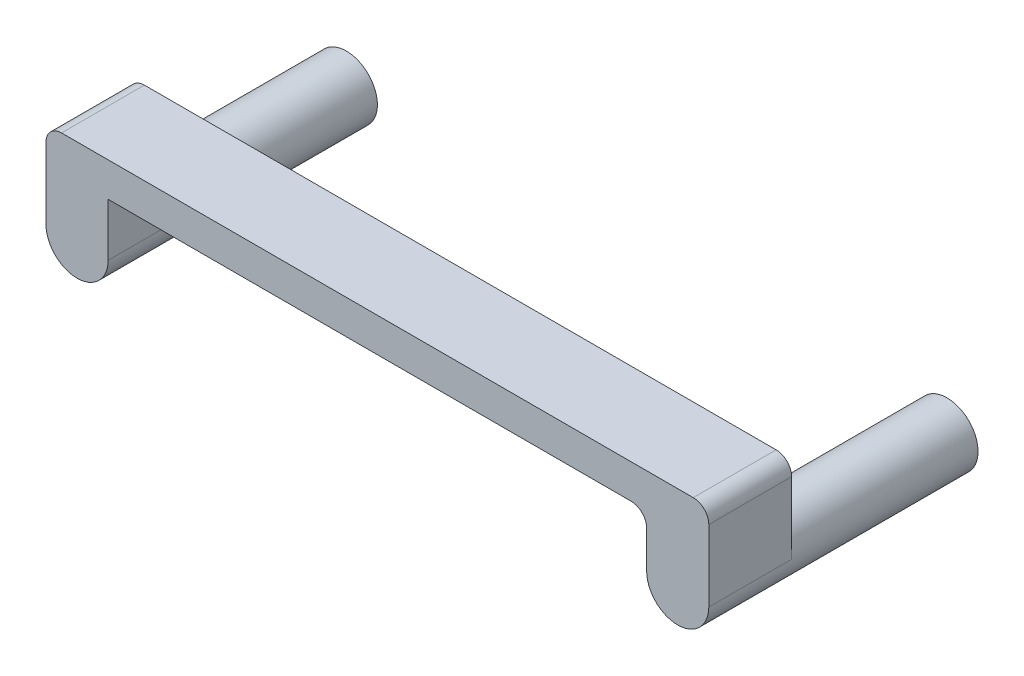
ISO-10303-21;
HEADER;
FILE_DESCRIPTION(('STEP AP214'),'2;1');
FILE_NAME('part.step','',(''),(''),'','','');
FILE_SCHEMA(('AUTOMOTIVE_DESIGN { 1 0 10303 214 1 1 1 1 }'));
ENDSEC;
DATA;
#1=APPLICATION_CONTEXT('core data for automotive mechanical design processes');
#2=APPLICATION_PROTOCOL_DEFINITION('international standard','automotive_design',2000,#1);
#3=PRODUCT_CONTEXT('',#1,'mechanical');
#4=PRODUCT('Part','Part','',(#3));
#5=PRODUCT_RELATED_PRODUCT_CATEGORY('part','',(#4));
#6=PRODUCT_DEFINITION_FORMATION('','',#4);
#7=PRODUCT_DEFINITION_CONTEXT('part definition',#1,'design');
#8=PRODUCT_DEFINITION('design','',#6,#7);
#9=PRODUCT_DEFINITION_SHAPE('','',#8);
#10=(LENGTH_UNIT() NAMED_UNIT(*) SI_UNIT(.MILLI.,.METRE.));
#11=(NAMED_UNIT(*) PLANE_ANGLE_UNIT() SI_UNIT($,.RADIAN.));
#12=(NAMED_UNIT(*) SI_UNIT($,.STERADIAN.) SOLID_ANGLE_UNIT());
#13=UNCERTAINTY_MEASURE_WITH_UNIT(LENGTH_MEASURE(1.E-05),#10,'distance_accuracy_value','');
#14=(GEOMETRIC_REPRESENTATION_CONTEXT(3) GLOBAL_UNCERTAINTY_ASSIGNED_CONTEXT((#13)) GLOBAL_UNIT_ASSIGNED_CONTEXT((#10,
#11,#12)) REPRESENTATION_CONTEXT('',''));
#15=CARTESIAN_POINT('',(0.,0.,0.));
#16=DIRECTION('',(0.,0.,1.));
#17=DIRECTION('',(1.,0.,0.));
#18=AXIS2_PLACEMENT_3D('',#15,#16,#17);
#19=CARTESIAN_POINT('',(-9.99999999999998,60.9,0.));
#20=DIRECTION('',(1.,0.,0.));
#21=DIRECTION('',(0.,0.,-1.));
#22=AXIS2_PLACEMENT_3D('',#19,#20,#21);
#23=PLANE('',#22);
#24=DIRECTION('',(0.,-1.,0.));
#25=VECTOR('',#24,1.);
#26=CARTESIAN_POINT('',(-9.99999999999999,60.9,-56.9370698042326));
#27=LINE('',#26,#25);
#28=CARTESIAN_POINT('',(-9.99999999999999,59.4,-56.9370698042326));
#29=VERTEX_POINT('',#28);
#30=CARTESIAN_POINT('',(-9.99999999999999,52.50000168,-56.9370698042326));
#31=VERTEX_POINT('',#30);
#32=EDGE_CURVE('E148',#29,#31,#27,.T.);
#33=ORIENTED_EDGE('',*,*,#32,.F.);
#34=DIRECTION('',(0.,0.,1.));
#35=VECTOR('',#34,1.);
#36=CARTESIAN_POINT('',(-10.,59.4,-64.9370698042326));
#37=LINE('',#36,#35);
#38=CARTESIAN_POINT('',(-10.,59.4,-64.9370698042326));
#39=VERTEX_POINT('',#38);
#40=EDGE_CURVE('E257',#29,#39,#37,.F.);
#41=ORIENTED_EDGE('',*,*,#40,.T.);
#42=DIRECTION('',(0.,-1.,0.));
#43=VECTOR('',#42,1.);
#44=CARTESIAN_POINT('',(-10.,60.9,-64.9370698042326));
#45=LINE('',#44,#43);
#46=CARTESIAN_POINT('',(-10.,52.50000168,-64.9370698042326));
#47=VERTEX_POINT('',#46);
#48=EDGE_CURVE('E236',#39,#47,#45,.T.);
#49=ORIENTED_EDGE('',*,*,#48,.T.);
#50=DIRECTION('',(0.,0.,-1.));
#51=VECTOR('',#50,1.);
#52=CARTESIAN_POINT('',(-9.99999999999999,52.50000168,-56.9370698042326));
#53=LINE('',#52,#51);
#54=EDGE_CURVE('E164',#31,#47,#53,.T.);
#55=ORIENTED_EDGE('',*,*,#54,.F.);
#56=EDGE_LOOP('',(#33,#41,#49,#55));
#57=FACE_BOUND('',#56,.T.);
#58=ADVANCED_FACE('F57',(#57),#23,.F.);
#59=CARTESIAN_POINT('',(0.,60.9,-56.9370698042326));
#60=DIRECTION('',(0.,0.,-1.));
#61=DIRECTION('',(0.,1.,0.));
#62=AXIS2_PLACEMENT_3D('',#59,#60,#61);
#63=PLANE('',#62);
#64=DIRECTION('',(1.,0.,0.));
#65=VECTOR('',#64,1.);
#66=CARTESIAN_POINT('',(0.,60.9,-56.9370698042326));
#67=LINE('',#66,#65);
#68=CARTESIAN_POINT('',(-8.49999999999999,60.9,-56.9370698042326));
#69=VERTEX_POINT('',#68);
#70=CARTESIAN_POINT('',(52.5,60.9,-56.9370698042326));
#71=VERTEX_POINT('',#70);
#72=EDGE_CURVE('E229',#69,#71,#67,.T.);
#73=ORIENTED_EDGE('',*,*,#72,.F.);
#74=CARTESIAN_POINT('',(-8.49999999999999,59.4,-56.9370698042326));
#75=DIRECTION('',(0.,0.,-1.));
#76=DIRECTION('',(0.,1.,0.));
#77=AXIS2_PLACEMENT_3D('',#74,#75,#76);
#78=CIRCLE('',#77,1.5);
#79=EDGE_CURVE('E255',#69,#29,#78,.F.);
#80=ORIENTED_EDGE('',*,*,#79,.T.);
#81=ORIENTED_EDGE('',*,*,#32,.T.);
#82=CARTESIAN_POINT('',(-7.00000145999998,52.50000168,-56.9370698042326));
#83=DIRECTION('',(0.,0.,-1.));
#84=DIRECTION('',(-1.,0.,0.));
#85=AXIS2_PLACEMENT_3D('',#82,#83,#84);
#86=CIRCLE('',#85,2.99999999999999);
#87=CARTESIAN_POINT('',(-4.,52.50000168,-56.9370698042326));
#88=VERTEX_POINT('',#87);
#89=EDGE_CURVE('E172',#88,#31,#86,.T.);
#90=ORIENTED_EDGE('',*,*,#89,.F.);
#91=DIRECTION('',(0.,1.,0.));
#92=VECTOR('',#91,1.);
#93=CARTESIAN_POINT('',(-4.00000000000002,49.1,-56.9370698042326));
#94=LINE('',#93,#92);
#95=CARTESIAN_POINT('',(-4.00000000000002,57.6,-56.9370698042326));
#96=VERTEX_POINT('',#95);
#97=EDGE_CURVE('E200',#88,#96,#94,.T.);
#98=ORIENTED_EDGE('',*,*,#97,.T.);
#99=DIRECTION('',(1.,0.,0.));
#100=VECTOR('',#99,1.);
#101=CARTESIAN_POINT('',(0.,57.6,-56.9370698042326));
#102=LINE('',#101,#100);
#103=CARTESIAN_POINT('',(46.5,57.6,-56.9370698042326));
#104=VERTEX_POINT('',#103);
#105=EDGE_CURVE('E208',#96,#104,#102,.T.);
#106=ORIENTED_EDGE('',*,*,#105,.T.);
#107=CARTESIAN_POINT('',(46.5,56.1,-56.9370698042326));
#108=DIRECTION('',(0.,0.,-1.));
#109=DIRECTION('',(0.,1.,0.));
#110=AXIS2_PLACEMENT_3D('',#107,#108,#109);
#111=CIRCLE('',#110,1.5);
#112=CARTESIAN_POINT('',(48.,56.1,-56.9370698042326));
#113=VERTEX_POINT('',#112);
#114=EDGE_CURVE('E65',#104,#113,#111,.T.);
#115=ORIENTED_EDGE('',*,*,#114,.T.);
#116=DIRECTION('',(0.,1.,0.));
#117=VECTOR('',#116,1.);
#118=CARTESIAN_POINT('',(48.,49.1,-56.9370698042326));
#119=LINE('',#118,#117);
#120=CARTESIAN_POINT('',(48.,52.50000168,-56.9370698042326));
#121=VERTEX_POINT('',#120);
#122=EDGE_CURVE('E163',#121,#113,#119,.T.);
#123=ORIENTED_EDGE('',*,*,#122,.F.);
#124=CARTESIAN_POINT('',(50.99999938,52.50000168,-56.9370698042326));
#125=DIRECTION('',(0.,0.,-1.));
#126=DIRECTION('',(-1.,0.,0.));
#127=AXIS2_PLACEMENT_3D('',#124,#125,#126);
#128=CIRCLE('',#127,2.99999999999999);
#129=CARTESIAN_POINT('',(54.,52.50000168,-56.9370698042326));
#130=VERTEX_POINT('',#129);
#131=EDGE_CURVE('E153',#130,#121,#128,.T.);
#132=ORIENTED_EDGE('',*,*,#131,.F.);
#133=DIRECTION('',(0.,-1.,0.));
#134=VECTOR('',#133,1.);
#135=CARTESIAN_POINT('',(54.,60.9,-56.9370698042326));
#136=LINE('',#135,#134);
#137=CARTESIAN_POINT('',(54.,59.4,-56.9370698042326));
#138=VERTEX_POINT('',#137);
#139=EDGE_CURVE('E138',#138,#130,#136,.T.);
#140=ORIENTED_EDGE('',*,*,#139,.F.);
#141=CARTESIAN_POINT('',(52.5,59.4,-56.9370698042326));
#142=DIRECTION('',(0.,0.,-1.));
#143=DIRECTION('',(0.,1.,0.));
#144=AXIS2_PLACEMENT_3D('',#141,#142,#143);
#145=CIRCLE('',#144,1.5);
#146=EDGE_CURVE('E253',#138,#71,#145,.F.);
#147=ORIENTED_EDGE('',*,*,#146,.T.);
#148=EDGE_LOOP('',(#73,#80,#81,#90,#98,#106,#115,#123,#132,#140,#147));
#149=FACE_BOUND('',#148,.T.);
#150=ADVANCED_FACE('F161',(#149),#63,.F.);
#151=CARTESIAN_POINT('',(0.,57.6,0.));
#152=DIRECTION('',(0.,1.,0.));
#153=DIRECTION('',(0.,0.,1.));
#154=AXIS2_PLACEMENT_3D('',#151,#152,#153);
#155=PLANE('',#154);
#156=CARTESIAN_POINT('',(8.00000000000002,57.6,-60.9370698042326));
#157=DIRECTION('',(0.,1.,0.));
#158=DIRECTION('',(0.,0.,1.));
#159=AXIS2_PLACEMENT_3D('',#156,#157,#158);
#160=CIRCLE('',#159,2.54999999999995);
#161=CARTESIAN_POINT('',(8.00000000000002,57.6,-58.3870698042327));
#162=VERTEX_POINT('',#161);
#163=EDGE_CURVE('E193',#162,#162,#160,.T.);
#164=ORIENTED_EDGE('',*,*,#163,.T.);
#165=EDGE_LOOP('',(#164));
#166=FACE_BOUND('',#165,.T.);
#167=CARTESIAN_POINT('',(24.,57.6,-60.9370698042326));
#168=DIRECTION('',(0.,1.,0.));
#169=DIRECTION('',(0.,0.,1.));
#170=AXIS2_PLACEMENT_3D('',#167,#168,#169);
#171=CIRCLE('',#170,2.54999999999994);
#172=CARTESIAN_POINT('',(24.,57.6,-58.3870698042327));
#173=VERTEX_POINT('',#172);
#174=EDGE_CURVE('E221',#173,#173,#171,.T.);
#175=ORIENTED_EDGE('',*,*,#174,.T.);
#176=EDGE_LOOP('',(#175));
#177=FACE_BOUND('',#176,.T.);
#178=CARTESIAN_POINT('',(16.,57.6,-60.9370698042326));
#179=DIRECTION('',(0.,1.,0.));
#180=DIRECTION('',(0.,0.,1.));
#181=AXIS2_PLACEMENT_3D('',#178,#179,#180);
#182=CIRCLE('',#181,2.54999999999995);
#183=CARTESIAN_POINT('',(16.,57.6,-58.3870698042327));
#184=VERTEX_POINT('',#183);
#185=EDGE_CURVE('E215',#184,#184,#182,.T.);
#186=ORIENTED_EDGE('',*,*,#185,.T.);
#187=EDGE_LOOP('',(#186));
#188=FACE_BOUND('',#187,.T.);
#189=CARTESIAN_POINT('',(0.,57.6,-60.9370698042326));
#190=DIRECTION('',(0.,1.,0.));
#191=DIRECTION('',(0.,0.,1.));
#192=AXIS2_PLACEMENT_3D('',#189,#190,#191);
#193=CIRCLE('',#192,2.54999999999995);
#194=CARTESIAN_POINT('',(0.,57.6,-58.3870698042327));
#195=VERTEX_POINT('',#194);
#196=EDGE_CURVE('E209',#195,#195,#193,.T.);
#197=ORIENTED_EDGE('',*,*,#196,.T.);
#198=EDGE_LOOP('',(#197));
#199=FACE_BOUND('',#198,.T.);
#200=DIRECTION('',(-1.,0.,0.));
#201=VECTOR('',#200,1.);
#202=CARTESIAN_POINT('',(0.,57.6,-64.9370698042326));
#203=LINE('',#202,#201);
#204=CARTESIAN_POINT('',(46.5,57.6,-64.9370698042326));
#205=VERTEX_POINT('',#204);
#206=CARTESIAN_POINT('',(-4.00000000000001,57.6,-64.9370698042326));
#207=VERTEX_POINT('',#206);
#208=EDGE_CURVE('E233',#205,#207,#203,.T.);
#209=ORIENTED_EDGE('',*,*,#208,.F.);
#210=DIRECTION('',(0.,0.,1.));
#211=VECTOR('',#210,1.);
#212=CARTESIAN_POINT('',(46.5,57.6,0.));
#213=LINE('',#212,#211);
#214=EDGE_CURVE('E262',#205,#104,#213,.T.);
#215=ORIENTED_EDGE('',*,*,#214,.T.);
#216=ORIENTED_EDGE('',*,*,#105,.F.);
#217=DIRECTION('',(0.,0.,1.));
#218=VECTOR('',#217,1.);
#219=CARTESIAN_POINT('',(-4.00000000000027,57.6,0.));
#220=LINE('',#219,#218);
#221=EDGE_CURVE('E197',#207,#96,#220,.T.);
#222=ORIENTED_EDGE('',*,*,#221,.F.);
#223=EDGE_LOOP('',(#209,#215,#216,#222));
#224=FACE_BOUND('',#223,.T.);
#225=ADVANCED_FACE('F276',(#166,#177,#188,#199,#224),#155,.F.);
#226=CARTESIAN_POINT('',(54.,60.9,0.));
#227=DIRECTION('',(-1.,0.,0.));
#228=DIRECTION('',(0.,-1.,0.));
#229=AXIS2_PLACEMENT_3D('',#226,#227,#228);
#230=PLANE('',#229);
#231=DIRECTION('',(0.,-1.,0.));
#232=VECTOR('',#231,1.);
#233=CARTESIAN_POINT('',(54.,60.9,-64.9370698042326));
#234=LINE('',#233,#232);
#235=CARTESIAN_POINT('',(54.,59.4,-64.9370698042326));
#236=VERTEX_POINT('',#235);
#237=CARTESIAN_POINT('',(54.,52.50000168,-64.9370698042326));
#238=VERTEX_POINT('',#237);
#239=EDGE_CURVE('E149',#236,#238,#234,.T.);
#240=ORIENTED_EDGE('',*,*,#239,.F.);
#241=DIRECTION('',(0.,0.,-1.));
#242=VECTOR('',#241,1.);
#243=CARTESIAN_POINT('',(54.,59.4,-56.9370698042326));
#244=LINE('',#243,#242);
#245=EDGE_CURVE('E144',#236,#138,#244,.F.);
#246=ORIENTED_EDGE('',*,*,#245,.T.);
#247=ORIENTED_EDGE('',*,*,#139,.T.);
#248=DIRECTION('',(0.,0.,-1.));
#249=VECTOR('',#248,1.);
#250=CARTESIAN_POINT('',(54.,52.50000168,-56.9370698042326));
#251=LINE('',#250,#249);
#252=EDGE_CURVE('E141',#130,#238,#251,.T.);
#253=ORIENTED_EDGE('',*,*,#252,.T.);
#254=EDGE_LOOP('',(#240,#246,#247,#253));
#255=FACE_BOUND('',#254,.T.);
#256=ADVANCED_FACE('F140',(#255),#230,.F.);
#257=CARTESIAN_POINT('',(0.,60.9,-64.9370698042326));
#258=DIRECTION('',(0.,0.,1.));
#259=DIRECTION('',(1.,0.,0.));
#260=AXIS2_PLACEMENT_3D('',#257,#258,#259);
#261=PLANE('',#260);
#262=ORIENTED_EDGE('',*,*,#48,.F.);
#263=CARTESIAN_POINT('',(-8.5,59.4,-64.9370698042326));
#264=DIRECTION('',(0.,0.,1.));
#265=DIRECTION('',(1.,0.,0.));
#266=AXIS2_PLACEMENT_3D('',#263,#264,#265);
#267=CIRCLE('',#266,1.5);
#268=CARTESIAN_POINT('',(-8.5,60.9,-64.9370698042326));
#269=VERTEX_POINT('',#268);
#270=EDGE_CURVE('E260',#39,#269,#267,.F.);
#271=ORIENTED_EDGE('',*,*,#270,.T.);
#272=DIRECTION('',(-1.,0.,0.));
#273=VECTOR('',#272,1.);
#274=CARTESIAN_POINT('',(0.,60.9,-64.9370698042326));
#275=LINE('',#274,#273);
#276=CARTESIAN_POINT('',(52.5,60.9,-64.9370698042326));
#277=VERTEX_POINT('',#276);
#278=EDGE_CURVE('E232',#277,#269,#275,.T.);
#279=ORIENTED_EDGE('',*,*,#278,.F.);
#280=CARTESIAN_POINT('',(52.5,59.4,-64.9370698042326));
#281=DIRECTION('',(0.,0.,1.));
#282=DIRECTION('',(1.,0.,0.));
#283=AXIS2_PLACEMENT_3D('',#280,#281,#282);
#284=CIRCLE('',#283,1.5);
#285=EDGE_CURVE('E72',#277,#236,#284,.F.);
#286=ORIENTED_EDGE('',*,*,#285,.T.);
#287=ORIENTED_EDGE('',*,*,#239,.T.);
#288=CARTESIAN_POINT('',(50.99999938,52.50000168,-64.9370698042326));
#289=DIRECTION('',(0.,0.,1.));
#290=DIRECTION('',(1.,0.,0.));
#291=AXIS2_PLACEMENT_3D('',#288,#289,#290);
#292=CIRCLE('',#291,2.99999999999999);
#293=CARTESIAN_POINT('',(48.,52.50000168,-64.9370698042326));
#294=VERTEX_POINT('',#293);
#295=EDGE_CURVE('E156',#294,#238,#292,.F.);
#296=ORIENTED_EDGE('',*,*,#295,.F.);
#297=DIRECTION('',(0.,1.,0.));
#298=VECTOR('',#297,1.);
#299=CARTESIAN_POINT('',(48.,49.1,-64.9370698042326));
#300=LINE('',#299,#298);
#301=CARTESIAN_POINT('',(48.,56.1,-64.9370698042326));
#302=VERTEX_POINT('',#301);
#303=EDGE_CURVE('E194',#294,#302,#300,.T.);
#304=ORIENTED_EDGE('',*,*,#303,.T.);
#305=CARTESIAN_POINT('',(46.5,56.1,-64.9370698042326));
#306=DIRECTION('',(0.,0.,1.));
#307=DIRECTION('',(1.,0.,0.));
#308=AXIS2_PLACEMENT_3D('',#305,#306,#307);
#309=CIRCLE('',#308,1.5);
#310=EDGE_CURVE('E12',#302,#205,#309,.T.);
#311=ORIENTED_EDGE('',*,*,#310,.T.);
#312=ORIENTED_EDGE('',*,*,#208,.T.);
#313=DIRECTION('',(0.,1.,0.));
#314=VECTOR('',#313,1.);
#315=CARTESIAN_POINT('',(-4.,49.1,-64.9370698042326));
#316=LINE('',#315,#314);
#317=CARTESIAN_POINT('',(-4.,52.50000168,-64.9370698042326));
#318=VERTEX_POINT('',#317);
#319=EDGE_CURVE('E196',#318,#207,#316,.T.);
#320=ORIENTED_EDGE('',*,*,#319,.F.);
#321=CARTESIAN_POINT('',(-7.00000145999998,52.50000168,-64.9370698042326));
#322=DIRECTION('',(0.,0.,1.));
#323=DIRECTION('',(1.,0.,0.));
#324=AXIS2_PLACEMENT_3D('',#321,#322,#323);
#325=CIRCLE('',#324,2.99999999999999);
#326=EDGE_CURVE('E188',#47,#318,#325,.F.);
#327=ORIENTED_EDGE('',*,*,#326,.F.);
#328=EDGE_LOOP('',(#262,#271,#279,#286,#287,#296,#304,#311,#312,#320,#327));
#329=FACE_BOUND('',#328,.T.);
#330=ADVANCED_FACE('F280',(#329),#261,.F.);
#331=CARTESIAN_POINT('',(0.,60.9,0.));
#332=DIRECTION('',(0.,1.,0.));
#333=DIRECTION('',(0.,0.,1.));
#334=AXIS2_PLACEMENT_3D('',#331,#332,#333);
#335=PLANE('',#334);
#336=ORIENTED_EDGE('',*,*,#278,.T.);
#337=DIRECTION('',(0.,0.,1.));
#338=VECTOR('',#337,1.);
#339=CARTESIAN_POINT('',(-8.49999999999999,60.9,-56.9370698042326));
#340=LINE('',#339,#338);
#341=EDGE_CURVE('E250',#269,#69,#340,.T.);
#342=ORIENTED_EDGE('',*,*,#341,.T.);
#343=ORIENTED_EDGE('',*,*,#72,.T.);
#344=DIRECTION('',(0.,0.,-1.));
#345=VECTOR('',#344,1.);
#346=CARTESIAN_POINT('',(52.5,60.9,-64.9370698042326));
#347=LINE('',#346,#345);
#348=EDGE_CURVE('E243',#71,#277,#347,.T.);
#349=ORIENTED_EDGE('',*,*,#348,.T.);
#350=EDGE_LOOP('',(#336,#342,#343,#349));
#351=FACE_BOUND('',#350,.T.);
#352=ADVANCED_FACE('F297',(#351),#335,.T.);
#353=CARTESIAN_POINT('',(8.00000000000002,59.4,-60.9370698042326));
#354=DIRECTION('',(0.,-1.,0.));
#355=DIRECTION('',(0.,0.,-1.));
#356=AXIS2_PLACEMENT_3D('',#353,#354,#355);
#357=CYLINDRICAL_SURFACE('',#356,2.54999999999995);
#358=CARTESIAN_POINT('',(8.00000000000002,59.4,-60.9370698042326));
#359=DIRECTION('',(0.,1.,0.));
#360=DIRECTION('',(0.,0.,1.));
#361=AXIS2_PLACEMENT_3D('',#358,#359,#360);
#362=CIRCLE('',#361,2.54999999999995);
#363=CARTESIAN_POINT('',(8.00000000000002,59.4,-58.3870698042327));
#364=VERTEX_POINT('',#363);
#365=EDGE_CURVE('E224',#364,#364,#362,.T.);
#366=ORIENTED_EDGE('',*,*,#365,.T.);
#367=EDGE_LOOP('',(#366));
#368=FACE_BOUND('',#367,.T.);
#369=ORIENTED_EDGE('',*,*,#163,.F.);
#370=EDGE_LOOP('',(#369));
#371=FACE_BOUND('',#370,.T.);
#372=ADVANCED_FACE('F334',(#368,#371),#357,.F.);
#373=CARTESIAN_POINT('',(0.,59.4,0.));
#374=DIRECTION('',(0.,1.,0.));
#375=DIRECTION('',(0.,0.,1.));
#376=AXIS2_PLACEMENT_3D('',#373,#374,#375);
#377=PLANE('',#376);
#378=ORIENTED_EDGE('',*,*,#365,.F.);
#379=EDGE_LOOP('',(#378));
#380=FACE_BOUND('',#379,.T.);
#381=ADVANCED_FACE('F346',(#380),#377,.F.);
#382=CARTESIAN_POINT('',(24.,59.4,-60.9370698042326));
#383=DIRECTION('',(0.,-1.,0.));
#384=DIRECTION('',(0.,0.,-1.));
#385=AXIS2_PLACEMENT_3D('',#382,#383,#384);
#386=CYLINDRICAL_SURFACE('',#385,2.54999999999994);
#387=CARTESIAN_POINT('',(24.,59.4,-60.9370698042326));
#388=DIRECTION('',(0.,1.,0.));
#389=DIRECTION('',(0.,0.,1.));
#390=AXIS2_PLACEMENT_3D('',#387,#388,#389);
#391=CIRCLE('',#390,2.54999999999994);
#392=CARTESIAN_POINT('',(24.,59.4,-58.3870698042327));
#393=VERTEX_POINT('',#392);
#394=EDGE_CURVE('E218',#393,#393,#391,.T.);
#395=ORIENTED_EDGE('',*,*,#394,.T.);
#396=EDGE_LOOP('',(#395));
#397=FACE_BOUND('',#396,.T.);
#398=ORIENTED_EDGE('',*,*,#174,.F.);
#399=EDGE_LOOP('',(#398));
#400=FACE_BOUND('',#399,.T.);
#401=ADVANCED_FACE('F350',(#397,#400),#386,.F.);
#402=CARTESIAN_POINT('',(0.,59.4,0.));
#403=DIRECTION('',(0.,1.,0.));
#404=DIRECTION('',(0.,0.,1.));
#405=AXIS2_PLACEMENT_3D('',#402,#403,#404);
#406=PLANE('',#405);
#407=ORIENTED_EDGE('',*,*,#394,.F.);
#408=EDGE_LOOP('',(#407));
#409=FACE_BOUND('',#408,.T.);
#410=ADVANCED_FACE('F354',(#409),#406,.F.);
#411=CARTESIAN_POINT('',(16.,59.4,-60.9370698042326));
#412=DIRECTION('',(0.,-1.,0.));
#413=DIRECTION('',(0.,0.,-1.));
#414=AXIS2_PLACEMENT_3D('',#411,#412,#413);
#415=CYLINDRICAL_SURFACE('',#414,2.54999999999995);
#416=CARTESIAN_POINT('',(16.,59.4,-60.9370698042326));
#417=DIRECTION('',(0.,1.,0.));
#418=DIRECTION('',(0.,0.,1.));
#419=AXIS2_PLACEMENT_3D('',#416,#417,#418);
#420=CIRCLE('',#419,2.54999999999995);
#421=CARTESIAN_POINT('',(16.,59.4,-58.3870698042327));
#422=VERTEX_POINT('',#421);
#423=EDGE_CURVE('E212',#422,#422,#420,.T.);
#424=ORIENTED_EDGE('',*,*,#423,.T.);
#425=EDGE_LOOP('',(#424));
#426=FACE_BOUND('',#425,.T.);
#427=ORIENTED_EDGE('',*,*,#185,.F.);
#428=EDGE_LOOP('',(#427));
#429=FACE_BOUND('',#428,.T.);
#430=ADVANCED_FACE('F358',(#426,#429),#415,.F.);
#431=CARTESIAN_POINT('',(0.,59.4,0.));
#432=DIRECTION('',(0.,1.,0.));
#433=DIRECTION('',(0.,0.,1.));
#434=AXIS2_PLACEMENT_3D('',#431,#432,#433);
#435=PLANE('',#434);
#436=ORIENTED_EDGE('',*,*,#423,.F.);
#437=EDGE_LOOP('',(#436));
#438=FACE_BOUND('',#437,.T.);
#439=ADVANCED_FACE('F362',(#438),#435,.F.);
#440=CARTESIAN_POINT('',(0.,59.4,-60.9370698042326));
#441=DIRECTION('',(0.,-1.,0.));
#442=DIRECTION('',(0.,0.,-1.));
#443=AXIS2_PLACEMENT_3D('',#440,#441,#442);
#444=CYLINDRICAL_SURFACE('',#443,2.54999999999995);
#445=CARTESIAN_POINT('',(0.,59.4,-60.9370698042326));
#446=DIRECTION('',(0.,1.,0.));
#447=DIRECTION('',(0.,0.,1.));
#448=AXIS2_PLACEMENT_3D('',#445,#446,#447);
#449=CIRCLE('',#448,2.54999999999995);
#450=CARTESIAN_POINT('',(0.,59.4,-58.3870698042327));
#451=VERTEX_POINT('',#450);
#452=EDGE_CURVE('E205',#451,#451,#449,.T.);
#453=ORIENTED_EDGE('',*,*,#452,.T.);
#454=EDGE_LOOP('',(#453));
#455=FACE_BOUND('',#454,.T.);
#456=ORIENTED_EDGE('',*,*,#196,.F.);
#457=EDGE_LOOP('',(#456));
#458=FACE_BOUND('',#457,.T.);
#459=ADVANCED_FACE('F366',(#455,#458),#444,.F.);
#460=CARTESIAN_POINT('',(0.,59.4,0.));
#461=DIRECTION('',(0.,1.,0.));
#462=DIRECTION('',(0.,0.,1.));
#463=AXIS2_PLACEMENT_3D('',#460,#461,#462);
#464=PLANE('',#463);
#465=ORIENTED_EDGE('',*,*,#452,.F.);
#466=EDGE_LOOP('',(#465));
#467=FACE_BOUND('',#466,.T.);
#468=ADVANCED_FACE('F370',(#467),#464,.F.);
#469=CARTESIAN_POINT('',(-4.00000000000027,49.1,0.));
#470=DIRECTION('',(-1.,0.,0.));
#471=DIRECTION('',(0.,0.,1.));
#472=AXIS2_PLACEMENT_3D('',#469,#470,#471);
#473=PLANE('',#472);
#474=ORIENTED_EDGE('',*,*,#97,.F.);
#475=DIRECTION('',(0.,0.,-1.));
#476=VECTOR('',#475,1.);
#477=CARTESIAN_POINT('',(-4.,52.50000168,-56.9370698042326));
#478=LINE('',#477,#476);
#479=EDGE_CURVE('E167',#88,#318,#478,.T.);
#480=ORIENTED_EDGE('',*,*,#479,.T.);
#481=ORIENTED_EDGE('',*,*,#319,.T.);
#482=ORIENTED_EDGE('',*,*,#221,.T.);
#483=EDGE_LOOP('',(#474,#480,#481,#482));
#484=FACE_BOUND('',#483,.T.);
#485=ADVANCED_FACE('F284',(#484),#473,.F.);
#486=CARTESIAN_POINT('',(48.,49.1,0.));
#487=DIRECTION('',(-1.,0.,0.));
#488=DIRECTION('',(0.,-1.,0.));
#489=AXIS2_PLACEMENT_3D('',#486,#487,#488);
#490=PLANE('',#489);
#491=ORIENTED_EDGE('',*,*,#122,.T.);
#492=DIRECTION('',(0.,0.,1.));
#493=VECTOR('',#492,1.);
#494=CARTESIAN_POINT('',(48.,56.1,0.));
#495=LINE('',#494,#493);
#496=EDGE_CURVE('E265',#113,#302,#495,.F.);
#497=ORIENTED_EDGE('',*,*,#496,.T.);
#498=ORIENTED_EDGE('',*,*,#303,.F.);
#499=DIRECTION('',(0.,0.,-1.));
#500=VECTOR('',#499,1.);
#501=CARTESIAN_POINT('',(48.,52.50000168,-56.9370698042326));
#502=LINE('',#501,#500);
#503=EDGE_CURVE('E157',#121,#294,#502,.T.);
#504=ORIENTED_EDGE('',*,*,#503,.F.);
#505=EDGE_LOOP('',(#491,#497,#498,#504));
#506=FACE_BOUND('',#505,.T.);
#507=ADVANCED_FACE('F272',(#506),#490,.T.);
#508=CARTESIAN_POINT('',(-7.00000145999999,52.50000168,-91.4223511784712));
#509=DIRECTION('',(0.,0.,1.));
#510=DIRECTION('',(1.,0.,0.));
#511=AXIS2_PLACEMENT_3D('',#508,#509,#510);
#512=CYLINDRICAL_SURFACE('',#511,2.24999999999999);
#513=CARTESIAN_POINT('',(-7.00000145999999,52.50000168,-82.9370698042326));
#514=DIRECTION('',(0.,0.,-1.));
#515=DIRECTION('',(-1.,0.,0.));
#516=AXIS2_PLACEMENT_3D('',#513,#514,#515);
#517=CIRCLE('',#516,2.24999999999999);
#518=CARTESIAN_POINT('',(-9.25000145999998,52.50000168,-82.9370698042326));
#519=VERTEX_POINT('',#518);
#520=EDGE_CURVE('E170',#519,#519,#517,.T.);
#521=ORIENTED_EDGE('',*,*,#520,.T.);
#522=EDGE_LOOP('',(#521));
#523=FACE_BOUND('',#522,.T.);
#524=CARTESIAN_POINT('',(-7.00000145999998,52.50000168,-64.9370698042326));
#525=DIRECTION('',(0.,0.,1.));
#526=DIRECTION('',(1.,0.,0.));
#527=AXIS2_PLACEMENT_3D('',#524,#525,#526);
#528=CIRCLE('',#527,2.24999999999999);
#529=CARTESIAN_POINT('',(-4.75000145999999,52.50000168,-64.9370698042326));
#530=VERTEX_POINT('',#529);
#531=EDGE_CURVE('E191',#530,#530,#528,.F.);
#532=ORIENTED_EDGE('',*,*,#531,.F.);
#533=EDGE_LOOP('',(#532));
#534=FACE_BOUND('',#533,.T.);
#535=ADVANCED_FACE('F377',(#523,#534),#512,.F.);
#536=CARTESIAN_POINT('',(-7.00000145999999,52.50000168,-91.4223511784712));
#537=DIRECTION('',(0.,0.,1.));
#538=DIRECTION('',(1.,0.,0.));
#539=AXIS2_PLACEMENT_3D('',#536,#537,#538);
#540=CYLINDRICAL_SURFACE('',#539,2.99999999999999);
#541=CARTESIAN_POINT('',(-7.00000145999999,52.50000168,-82.9370698042326));
#542=DIRECTION('',(0.,0.,-1.));
#543=DIRECTION('',(-1.,0.,0.));
#544=AXIS2_PLACEMENT_3D('',#541,#542,#543);
#545=CIRCLE('',#544,2.99999999999999);
#546=CARTESIAN_POINT('',(-10.00000146,52.50000168,-82.9370698042326));
#547=VERTEX_POINT('',#546);
#548=EDGE_CURVE('E182',#547,#547,#545,.T.);
#549=ORIENTED_EDGE('',*,*,#548,.F.);
#550=EDGE_LOOP('',(#549));
#551=FACE_BOUND('',#550,.T.);
#552=ORIENTED_EDGE('',*,*,#326,.T.);
#553=ORIENTED_EDGE('',*,*,#479,.F.);
#554=ORIENTED_EDGE('',*,*,#89,.T.);
#555=ORIENTED_EDGE('',*,*,#54,.T.);
#556=EDGE_LOOP('',(#552,#553,#554,#555));
#557=FACE_BOUND('',#556,.T.);
#558=ADVANCED_FACE('F287',(#551,#557),#540,.T.);
#559=CARTESIAN_POINT('',(54.5,2.99999999999998,-82.9370698042326));
#560=DIRECTION('',(0.,0.,-1.));
#561=DIRECTION('',(-1.,0.,0.));
#562=AXIS2_PLACEMENT_3D('',#559,#560,#561);
#563=PLANE('',#562);
#564=ORIENTED_EDGE('',*,*,#520,.F.);
#565=EDGE_LOOP('',(#564));
#566=FACE_BOUND('',#565,.T.);
#567=ORIENTED_EDGE('',*,*,#548,.T.);
#568=EDGE_LOOP('',(#567));
#569=FACE_BOUND('',#568,.T.);
#570=ADVANCED_FACE('F380',(#566,#569),#563,.T.);
#571=CARTESIAN_POINT('',(50.99999938,52.50000168,-91.4223511784712));
#572=DIRECTION('',(0.,0.,1.));
#573=DIRECTION('',(1.,0.,0.));
#574=AXIS2_PLACEMENT_3D('',#571,#572,#573);
#575=CYLINDRICAL_SURFACE('',#574,2.24999999999999);
#576=CARTESIAN_POINT('',(50.99999938,52.50000168,-82.9370698042326));
#577=DIRECTION('',(0.,0.,-1.));
#578=DIRECTION('',(-1.,0.,0.));
#579=AXIS2_PLACEMENT_3D('',#576,#577,#578);
#580=CIRCLE('',#579,2.24999999999999);
#581=CARTESIAN_POINT('',(48.74999938,52.50000168,-82.9370698042326));
#582=VERTEX_POINT('',#581);
#583=EDGE_CURVE('E179',#582,#582,#580,.T.);
#584=ORIENTED_EDGE('',*,*,#583,.T.);
#585=EDGE_LOOP('',(#584));
#586=FACE_BOUND('',#585,.T.);
#587=CARTESIAN_POINT('',(50.99999938,52.50000168,-64.9370698042326));
#588=DIRECTION('',(0.,0.,1.));
#589=DIRECTION('',(1.,0.,0.));
#590=AXIS2_PLACEMENT_3D('',#587,#588,#589);
#591=CIRCLE('',#590,2.24999999999999);
#592=CARTESIAN_POINT('',(53.24999938,52.50000168,-64.9370698042326));
#593=VERTEX_POINT('',#592);
#594=EDGE_CURVE('E201',#593,#593,#591,.F.);
#595=ORIENTED_EDGE('',*,*,#594,.F.);
#596=EDGE_LOOP('',(#595));
#597=FACE_BOUND('',#596,.T.);
#598=ADVANCED_FACE('F387',(#586,#597),#575,.F.);
#599=CARTESIAN_POINT('',(50.99999938,52.50000168,-91.4223511784712));
#600=DIRECTION('',(0.,0.,1.));
#601=DIRECTION('',(1.,0.,0.));
#602=AXIS2_PLACEMENT_3D('',#599,#600,#601);
#603=CYLINDRICAL_SURFACE('',#602,2.99999999999999);
#604=CARTESIAN_POINT('',(50.99999938,52.50000168,-82.9370698042326));
#605=DIRECTION('',(0.,0.,-1.));
#606=DIRECTION('',(-1.,0.,0.));
#607=AXIS2_PLACEMENT_3D('',#604,#605,#606);
#608=CIRCLE('',#607,2.99999999999999);
#609=CARTESIAN_POINT('',(47.99999938,52.50000168,-82.9370698042326));
#610=VERTEX_POINT('',#609);
#611=EDGE_CURVE('E176',#610,#610,#608,.T.);
#612=ORIENTED_EDGE('',*,*,#611,.F.);
#613=EDGE_LOOP('',(#612));
#614=FACE_BOUND('',#613,.T.);
#615=ORIENTED_EDGE('',*,*,#295,.T.);
#616=ORIENTED_EDGE('',*,*,#252,.F.);
#617=ORIENTED_EDGE('',*,*,#131,.T.);
#618=ORIENTED_EDGE('',*,*,#503,.T.);
#619=EDGE_LOOP('',(#615,#616,#617,#618));
#620=FACE_BOUND('',#619,.T.);
#621=ADVANCED_FACE('F152',(#614,#620),#603,.T.);
#622=CARTESIAN_POINT('',(54.5,2.99999999999998,-82.9370698042326));
#623=DIRECTION('',(0.,0.,-1.));
#624=DIRECTION('',(-1.,0.,0.));
#625=AXIS2_PLACEMENT_3D('',#622,#623,#624);
#626=PLANE('',#625);
#627=ORIENTED_EDGE('',*,*,#583,.F.);
#628=EDGE_LOOP('',(#627));
#629=FACE_BOUND('',#628,.T.);
#630=ORIENTED_EDGE('',*,*,#611,.T.);
#631=EDGE_LOOP('',(#630));
#632=FACE_BOUND('',#631,.T.);
#633=ADVANCED_FACE('F326',(#629,#632),#626,.T.);
#634=ORIENTED_EDGE('',*,*,#531,.T.);
#635=EDGE_LOOP('',(#634));
#636=FACE_BOUND('',#635,.T.);
#637=ADVANCED_FACE('F319',(#636),#261,.F.);
#638=ORIENTED_EDGE('',*,*,#594,.T.);
#639=EDGE_LOOP('',(#638));
#640=FACE_BOUND('',#639,.T.);
#641=ADVANCED_FACE('F314',(#640),#261,.F.);
#642=CARTESIAN_POINT('',(-8.49999999999998,59.4,0.));
#643=DIRECTION('',(0.,0.,-1.));
#644=DIRECTION('',(-1.,0.,0.));
#645=AXIS2_PLACEMENT_3D('',#642,#643,#644);
#646=CYLINDRICAL_SURFACE('',#645,1.5);
#647=ORIENTED_EDGE('',*,*,#270,.F.);
#648=ORIENTED_EDGE('',*,*,#40,.F.);
#649=ORIENTED_EDGE('',*,*,#79,.F.);
#650=ORIENTED_EDGE('',*,*,#341,.F.);
#651=EDGE_LOOP('',(#647,#648,#649,#650));
#652=FACE_BOUND('',#651,.T.);
#653=ADVANCED_FACE('F294',(#652),#646,.T.);
#654=CARTESIAN_POINT('',(46.5,56.1,0.));
#655=DIRECTION('',(0.,0.,1.));
#656=DIRECTION('',(0.,-1.,0.));
#657=AXIS2_PLACEMENT_3D('',#654,#655,#656);
#658=CYLINDRICAL_SURFACE('',#657,1.5);
#659=ORIENTED_EDGE('',*,*,#310,.F.);
#660=ORIENTED_EDGE('',*,*,#496,.F.);
#661=ORIENTED_EDGE('',*,*,#114,.F.);
#662=ORIENTED_EDGE('',*,*,#214,.F.);
#663=EDGE_LOOP('',(#659,#660,#661,#662));
#664=FACE_BOUND('',#663,.T.);
#665=ADVANCED_FACE('F274',(#664),#658,.F.);
#666=CARTESIAN_POINT('',(52.5,59.4,0.));
#667=DIRECTION('',(0.,0.,1.));
#668=DIRECTION('',(0.,-1.,0.));
#669=AXIS2_PLACEMENT_3D('',#666,#667,#668);
#670=CYLINDRICAL_SURFACE('',#669,1.5);
#671=ORIENTED_EDGE('',*,*,#146,.F.);
#672=ORIENTED_EDGE('',*,*,#245,.F.);
#673=ORIENTED_EDGE('',*,*,#285,.F.);
#674=ORIENTED_EDGE('',*,*,#348,.F.);
#675=EDGE_LOOP('',(#671,#672,#673,#674));
#676=FACE_BOUND('',#675,.T.);
#677=ADVANCED_FACE('F59',(#676),#670,.T.);
#678=CLOSED_SHELL('',(#58,#150,#225,#256,#330,#352,#372,#381,#401,#410,#430,#439,#459,#468,#485,
#507,#535,#558,#570,#598,#621,#633,#637,#641,#653,#665,#677));
#679=MANIFOLD_SOLID_BREP('B2',#678);
#680=ADVANCED_BREP_SHAPE_REPRESENTATION('',(#18,#679),#14);
#681=SHAPE_DEFINITION_REPRESENTATION(#9,#680);
ENDSEC;
END-ISO-10303-21;
